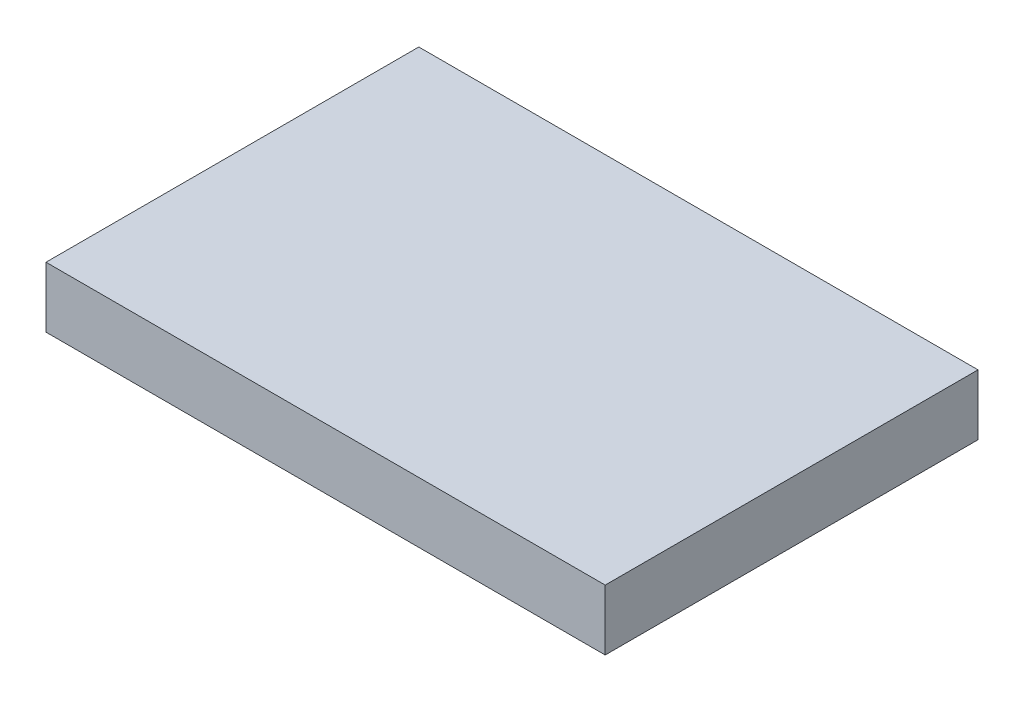
ISO-10303-21;
HEADER;
FILE_DESCRIPTION(('STEP AP214'),'2;1');
FILE_NAME('part.step','',(''),(''),'','','');
FILE_SCHEMA(('AUTOMOTIVE_DESIGN { 1 0 10303 214 1 1 1 1 }'));
ENDSEC;
DATA;
#1=APPLICATION_CONTEXT('core data for automotive mechanical design processes');
#2=APPLICATION_PROTOCOL_DEFINITION('international standard','automotive_design',2000,#1);
#3=PRODUCT_CONTEXT('',#1,'mechanical');
#4=PRODUCT('Part','Part','',(#3));
#5=PRODUCT_RELATED_PRODUCT_CATEGORY('part','',(#4));
#6=PRODUCT_DEFINITION_FORMATION('','',#4);
#7=PRODUCT_DEFINITION_CONTEXT('part definition',#1,'design');
#8=PRODUCT_DEFINITION('design','',#6,#7);
#9=PRODUCT_DEFINITION_SHAPE('','',#8);
#10=(LENGTH_UNIT() NAMED_UNIT(*) SI_UNIT(.MILLI.,.METRE.));
#11=(NAMED_UNIT(*) PLANE_ANGLE_UNIT() SI_UNIT($,.RADIAN.));
#12=(NAMED_UNIT(*) SI_UNIT($,.STERADIAN.) SOLID_ANGLE_UNIT());
#13=UNCERTAINTY_MEASURE_WITH_UNIT(LENGTH_MEASURE(1.E-05),#10,'distance_accuracy_value','');
#14=(GEOMETRIC_REPRESENTATION_CONTEXT(3) GLOBAL_UNCERTAINTY_ASSIGNED_CONTEXT((#13)) GLOBAL_UNIT_ASSIGNED_CONTEXT((#10,
#11,#12)) REPRESENTATION_CONTEXT('',''));
#15=CARTESIAN_POINT('',(0.,0.,0.));
#16=DIRECTION('',(0.,0.,1.));
#17=DIRECTION('',(1.,0.,0.));
#18=AXIS2_PLACEMENT_3D('',#15,#16,#17);
#19=CARTESIAN_POINT('',(-30.,6.5,20.));
#20=DIRECTION('',(1.,0.,0.));
#21=DIRECTION('',(0.,0.,-1.));
#22=AXIS2_PLACEMENT_3D('',#19,#20,#21);
#23=PLANE('',#22);
#24=DIRECTION('',(0.,0.,1.));
#25=VECTOR('',#24,1.);
#26=CARTESIAN_POINT('',(-30.,0.,20.));
#27=LINE('',#26,#25);
#28=CARTESIAN_POINT('',(-30.,0.,-20.));
#29=VERTEX_POINT('',#28);
#30=CARTESIAN_POINT('',(-30.,0.,20.));
#31=VERTEX_POINT('',#30);
#32=EDGE_CURVE('E100',#29,#31,#27,.T.);
#33=ORIENTED_EDGE('',*,*,#32,.T.);
#34=DIRECTION('',(0.,-1.,0.));
#35=VECTOR('',#34,1.);
#36=CARTESIAN_POINT('',(-30.,6.5,20.));
#37=LINE('',#36,#35);
#38=CARTESIAN_POINT('',(-30.,6.5,20.));
#39=VERTEX_POINT('',#38);
#40=EDGE_CURVE('E11',#39,#31,#37,.T.);
#41=ORIENTED_EDGE('',*,*,#40,.F.);
#42=DIRECTION('',(0.,0.,1.));
#43=VECTOR('',#42,1.);
#44=CARTESIAN_POINT('',(-30.,6.5,20.));
#45=LINE('',#44,#43);
#46=CARTESIAN_POINT('',(-30.,6.5,-20.));
#47=VERTEX_POINT('',#46);
#48=EDGE_CURVE('E88',#47,#39,#45,.T.);
#49=ORIENTED_EDGE('',*,*,#48,.F.);
#50=DIRECTION('',(0.,-1.,0.));
#51=VECTOR('',#50,1.);
#52=CARTESIAN_POINT('',(-30.,6.5,-20.));
#53=LINE('',#52,#51);
#54=EDGE_CURVE('E96',#47,#29,#53,.T.);
#55=ORIENTED_EDGE('',*,*,#54,.T.);
#56=EDGE_LOOP('',(#33,#41,#49,#55));
#57=FACE_BOUND('',#56,.T.);
#58=ADVANCED_FACE('F37',(#57),#23,.F.);
#59=CARTESIAN_POINT('',(30.,6.5,20.));
#60=DIRECTION('',(0.,0.,-1.));
#61=DIRECTION('',(-1.,0.,0.));
#62=AXIS2_PLACEMENT_3D('',#59,#60,#61);
#63=PLANE('',#62);
#64=DIRECTION('',(1.,0.,0.));
#65=VECTOR('',#64,1.);
#66=CARTESIAN_POINT('',(30.,0.,20.));
#67=LINE('',#66,#65);
#68=CARTESIAN_POINT('',(30.,0.,20.));
#69=VERTEX_POINT('',#68);
#70=EDGE_CURVE('E92',#31,#69,#67,.T.);
#71=ORIENTED_EDGE('',*,*,#70,.T.);
#72=DIRECTION('',(0.,-1.,0.));
#73=VECTOR('',#72,1.);
#74=CARTESIAN_POINT('',(30.,6.5,20.));
#75=LINE('',#74,#73);
#76=CARTESIAN_POINT('',(30.,6.5,20.));
#77=VERTEX_POINT('',#76);
#78=EDGE_CURVE('E45',#77,#69,#75,.T.);
#79=ORIENTED_EDGE('',*,*,#78,.F.);
#80=DIRECTION('',(1.,0.,0.));
#81=VECTOR('',#80,1.);
#82=CARTESIAN_POINT('',(30.,6.5,20.));
#83=LINE('',#82,#81);
#84=EDGE_CURVE('E83',#39,#77,#83,.T.);
#85=ORIENTED_EDGE('',*,*,#84,.F.);
#86=ORIENTED_EDGE('',*,*,#40,.T.);
#87=EDGE_LOOP('',(#71,#79,#85,#86));
#88=FACE_BOUND('',#87,.T.);
#89=ADVANCED_FACE('F91',(#88),#63,.F.);
#90=CARTESIAN_POINT('',(30.,6.5,20.));
#91=DIRECTION('',(-1.,0.,0.));
#92=DIRECTION('',(0.,0.,1.));
#93=AXIS2_PLACEMENT_3D('',#90,#91,#92);
#94=PLANE('',#93);
#95=DIRECTION('',(0.,0.,-1.));
#96=VECTOR('',#95,1.);
#97=CARTESIAN_POINT('',(30.,0.,20.));
#98=LINE('',#97,#96);
#99=CARTESIAN_POINT('',(30.,0.,-20.));
#100=VERTEX_POINT('',#99);
#101=EDGE_CURVE('E70',#69,#100,#98,.T.);
#102=ORIENTED_EDGE('',*,*,#101,.T.);
#103=DIRECTION('',(0.,-1.,0.));
#104=VECTOR('',#103,1.);
#105=CARTESIAN_POINT('',(30.,6.5,-20.));
#106=LINE('',#105,#104);
#107=CARTESIAN_POINT('',(30.,6.5,-20.));
#108=VERTEX_POINT('',#107);
#109=EDGE_CURVE('E93',#108,#100,#106,.T.);
#110=ORIENTED_EDGE('',*,*,#109,.F.);
#111=DIRECTION('',(0.,0.,-1.));
#112=VECTOR('',#111,1.);
#113=CARTESIAN_POINT('',(30.,6.5,20.));
#114=LINE('',#113,#112);
#115=EDGE_CURVE('E86',#77,#108,#114,.T.);
#116=ORIENTED_EDGE('',*,*,#115,.F.);
#117=ORIENTED_EDGE('',*,*,#78,.T.);
#118=EDGE_LOOP('',(#102,#110,#116,#117));
#119=FACE_BOUND('',#118,.T.);
#120=ADVANCED_FACE('F94',(#119),#94,.F.);
#121=CARTESIAN_POINT('',(30.,6.5,-20.));
#122=DIRECTION('',(0.,0.,1.));
#123=DIRECTION('',(1.,0.,0.));
#124=AXIS2_PLACEMENT_3D('',#121,#122,#123);
#125=PLANE('',#124);
#126=DIRECTION('',(-1.,0.,0.));
#127=VECTOR('',#126,1.);
#128=CARTESIAN_POINT('',(30.,0.,-20.));
#129=LINE('',#128,#127);
#130=EDGE_CURVE('E76',#100,#29,#129,.T.);
#131=ORIENTED_EDGE('',*,*,#130,.T.);
#132=ORIENTED_EDGE('',*,*,#54,.F.);
#133=DIRECTION('',(-1.,0.,0.));
#134=VECTOR('',#133,1.);
#135=CARTESIAN_POINT('',(30.,6.5,-20.));
#136=LINE('',#135,#134);
#137=EDGE_CURVE('E53',#108,#47,#136,.T.);
#138=ORIENTED_EDGE('',*,*,#137,.F.);
#139=ORIENTED_EDGE('',*,*,#109,.T.);
#140=EDGE_LOOP('',(#131,#132,#138,#139));
#141=FACE_BOUND('',#140,.T.);
#142=ADVANCED_FACE('F107',(#141),#125,.F.);
#143=CARTESIAN_POINT('',(0.,6.5,0.));
#144=DIRECTION('',(0.,1.,0.));
#145=DIRECTION('',(0.,0.,1.));
#146=AXIS2_PLACEMENT_3D('',#143,#144,#145);
#147=PLANE('',#146);
#148=ORIENTED_EDGE('',*,*,#48,.T.);
#149=ORIENTED_EDGE('',*,*,#84,.T.);
#150=ORIENTED_EDGE('',*,*,#115,.T.);
#151=ORIENTED_EDGE('',*,*,#137,.T.);
#152=EDGE_LOOP('',(#148,#149,#150,#151));
#153=FACE_BOUND('',#152,.T.);
#154=ADVANCED_FACE('F84',(#153),#147,.T.);
#155=CARTESIAN_POINT('',(0.,0.,0.));
#156=DIRECTION('',(0.,1.,0.));
#157=DIRECTION('',(0.,0.,1.));
#158=AXIS2_PLACEMENT_3D('',#155,#156,#157);
#159=PLANE('',#158);
#160=ORIENTED_EDGE('',*,*,#32,.F.);
#161=ORIENTED_EDGE('',*,*,#130,.F.);
#162=ORIENTED_EDGE('',*,*,#101,.F.);
#163=ORIENTED_EDGE('',*,*,#70,.F.);
#164=EDGE_LOOP('',(#160,#161,#162,#163));
#165=FACE_BOUND('',#164,.T.);
#166=ADVANCED_FACE('F110',(#165),#159,.F.);
#167=CLOSED_SHELL('',(#58,#89,#120,#142,#154,#166));
#168=MANIFOLD_SOLID_BREP('B2',#167);
#169=ADVANCED_BREP_SHAPE_REPRESENTATION('',(#18,#168),#14);
#170=SHAPE_DEFINITION_REPRESENTATION(#9,#169);
ENDSEC;
END-ISO-10303-21;
